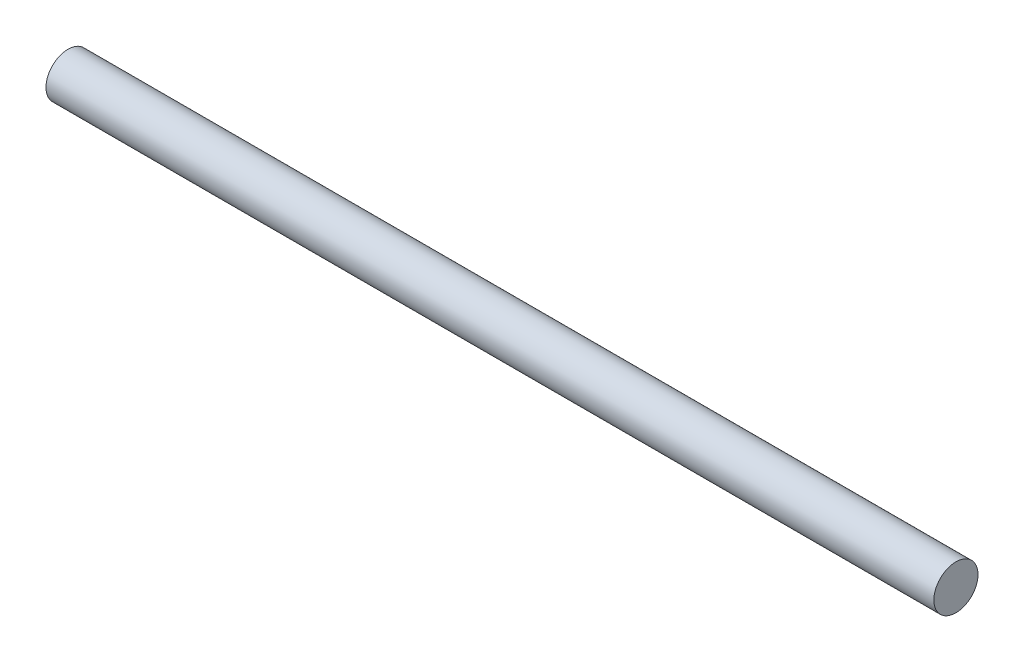
ISO-10303-21;
HEADER;
FILE_DESCRIPTION(('STEP AP214'),'2;1');
FILE_NAME('part.step','',(''),(''),'','','');
FILE_SCHEMA(('AUTOMOTIVE_DESIGN { 1 0 10303 214 1 1 1 1 }'));
ENDSEC;
DATA;
#1=APPLICATION_CONTEXT('core data for automotive mechanical design processes');
#2=APPLICATION_PROTOCOL_DEFINITION('international standard','automotive_design',2000,#1);
#3=PRODUCT_CONTEXT('',#1,'mechanical');
#4=PRODUCT('Part','Part','',(#3));
#5=PRODUCT_RELATED_PRODUCT_CATEGORY('part','',(#4));
#6=PRODUCT_DEFINITION_FORMATION('','',#4);
#7=PRODUCT_DEFINITION_CONTEXT('part definition',#1,'design');
#8=PRODUCT_DEFINITION('design','',#6,#7);
#9=PRODUCT_DEFINITION_SHAPE('','',#8);
#10=(LENGTH_UNIT() NAMED_UNIT(*) SI_UNIT(.MILLI.,.METRE.));
#11=(NAMED_UNIT(*) PLANE_ANGLE_UNIT() SI_UNIT($,.RADIAN.));
#12=(NAMED_UNIT(*) SI_UNIT($,.STERADIAN.) SOLID_ANGLE_UNIT());
#13=UNCERTAINTY_MEASURE_WITH_UNIT(LENGTH_MEASURE(1.E-05),#10,'distance_accuracy_value','');
#14=(GEOMETRIC_REPRESENTATION_CONTEXT(3) GLOBAL_UNCERTAINTY_ASSIGNED_CONTEXT((#13)) GLOBAL_UNIT_ASSIGNED_CONTEXT((#10,
#11,#12)) REPRESENTATION_CONTEXT('',''));
#15=CARTESIAN_POINT('',(0.,0.,0.));
#16=DIRECTION('',(0.,0.,1.));
#17=DIRECTION('',(1.,0.,0.));
#18=AXIS2_PLACEMENT_3D('',#15,#16,#17);
#19=CARTESIAN_POINT('',(30.15,0.,0.));
#20=DIRECTION('',(-1.,0.,0.));
#21=DIRECTION('',(0.,0.,1.));
#22=AXIS2_PLACEMENT_3D('',#19,#20,#21);
#23=CYLINDRICAL_SURFACE('',#22,1.5);
#24=CARTESIAN_POINT('',(30.15,0.,0.));
#25=DIRECTION('',(1.,0.,0.));
#26=DIRECTION('',(0.,0.,-1.));
#27=AXIS2_PLACEMENT_3D('',#24,#25,#26);
#28=CIRCLE('',#27,1.5);
#29=CARTESIAN_POINT('',(30.15,0.,-1.5));
#30=VERTEX_POINT('',#29);
#31=EDGE_CURVE('E10',#30,#30,#28,.T.);
#32=ORIENTED_EDGE('',*,*,#31,.F.);
#33=EDGE_LOOP('',(#32));
#34=FACE_BOUND('',#33,.T.);
#35=CARTESIAN_POINT('',(-30.15,0.,0.));
#36=DIRECTION('',(1.,0.,0.));
#37=DIRECTION('',(0.,0.,-1.));
#38=AXIS2_PLACEMENT_3D('',#35,#36,#37);
#39=CIRCLE('',#38,1.5);
#40=CARTESIAN_POINT('',(-30.15,0.,-1.5));
#41=VERTEX_POINT('',#40);
#42=EDGE_CURVE('E42',#41,#41,#39,.T.);
#43=ORIENTED_EDGE('',*,*,#42,.T.);
#44=EDGE_LOOP('',(#43));
#45=FACE_BOUND('',#44,.T.);
#46=ADVANCED_FACE('F39',(#34,#45),#23,.T.);
#47=CARTESIAN_POINT('',(30.15,0.,0.));
#48=DIRECTION('',(1.,0.,0.));
#49=DIRECTION('',(0.,0.,-1.));
#50=AXIS2_PLACEMENT_3D('',#47,#48,#49);
#51=PLANE('',#50);
#52=ORIENTED_EDGE('',*,*,#31,.T.);
#53=EDGE_LOOP('',(#52));
#54=FACE_BOUND('',#53,.T.);
#55=ADVANCED_FACE('F54',(#54),#51,.T.);
#56=CARTESIAN_POINT('',(-30.15,0.,0.));
#57=DIRECTION('',(1.,0.,0.));
#58=DIRECTION('',(0.,0.,-1.));
#59=AXIS2_PLACEMENT_3D('',#56,#57,#58);
#60=PLANE('',#59);
#61=ORIENTED_EDGE('',*,*,#42,.F.);
#62=EDGE_LOOP('',(#61));
#63=FACE_BOUND('',#62,.T.);
#64=ADVANCED_FACE('F52',(#63),#60,.F.);
#65=CLOSED_SHELL('',(#46,#55,#64));
#66=MANIFOLD_SOLID_BREP('B2',#65);
#67=ADVANCED_BREP_SHAPE_REPRESENTATION('',(#18,#66),#14);
#68=SHAPE_DEFINITION_REPRESENTATION(#9,#67);
ENDSEC;
END-ISO-10303-21;
